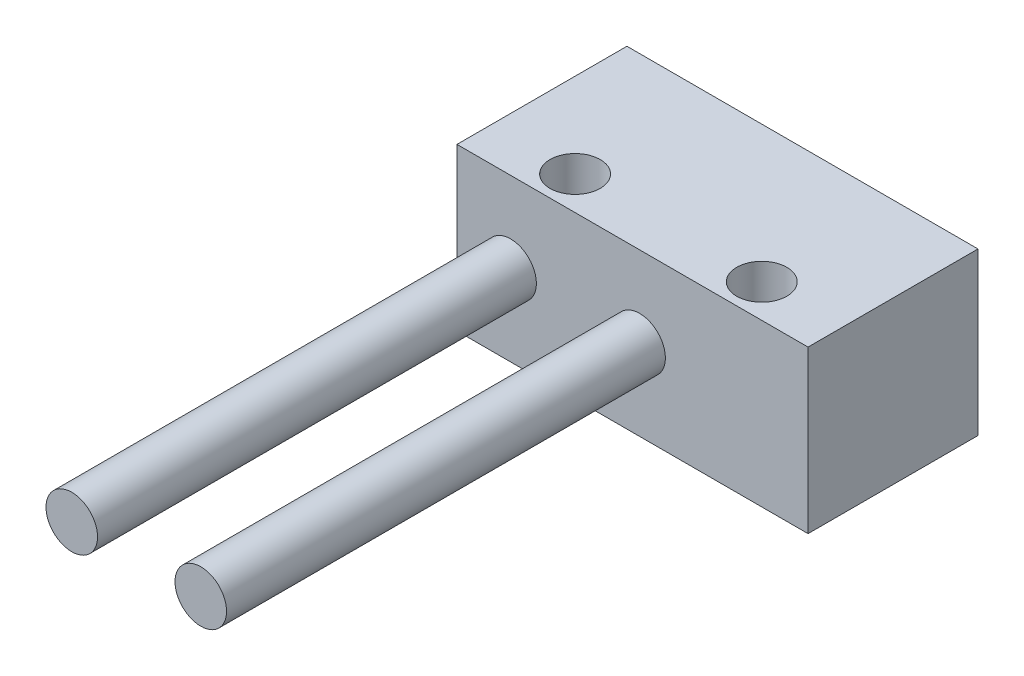
ISO-10303-21;
HEADER;
FILE_DESCRIPTION(('STEP AP214'),'2;1');
FILE_NAME('part.step','',(''),(''),'','','');
FILE_SCHEMA(('AUTOMOTIVE_DESIGN { 1 0 10303 214 1 1 1 1 }'));
ENDSEC;
DATA;
#1=APPLICATION_CONTEXT('core data for automotive mechanical design processes');
#2=APPLICATION_PROTOCOL_DEFINITION('international standard','automotive_design',2000,#1);
#3=PRODUCT_CONTEXT('',#1,'mechanical');
#4=PRODUCT('Part','Part','',(#3));
#5=PRODUCT_RELATED_PRODUCT_CATEGORY('part','',(#4));
#6=PRODUCT_DEFINITION_FORMATION('','',#4);
#7=PRODUCT_DEFINITION_CONTEXT('part definition',#1,'design');
#8=PRODUCT_DEFINITION('design','',#6,#7);
#9=PRODUCT_DEFINITION_SHAPE('','',#8);
#10=(LENGTH_UNIT() NAMED_UNIT(*) SI_UNIT(.MILLI.,.METRE.));
#11=(NAMED_UNIT(*) PLANE_ANGLE_UNIT() SI_UNIT($,.RADIAN.));
#12=(NAMED_UNIT(*) SI_UNIT($,.STERADIAN.) SOLID_ANGLE_UNIT());
#13=UNCERTAINTY_MEASURE_WITH_UNIT(LENGTH_MEASURE(1.E-05),#10,'distance_accuracy_value','');
#14=(GEOMETRIC_REPRESENTATION_CONTEXT(3) GLOBAL_UNCERTAINTY_ASSIGNED_CONTEXT((#13)) GLOBAL_UNIT_ASSIGNED_CONTEXT((#10,
#11,#12)) REPRESENTATION_CONTEXT('',''));
#15=CARTESIAN_POINT('',(0.,0.,0.));
#16=DIRECTION('',(0.,0.,1.));
#17=DIRECTION('',(1.,0.,0.));
#18=AXIS2_PLACEMENT_3D('',#15,#16,#17);
#19=CARTESIAN_POINT('',(0.,5.8,-6.1));
#20=DIRECTION('',(0.,0.,1.));
#21=DIRECTION('',(1.,0.,0.));
#22=AXIS2_PLACEMENT_3D('',#19,#20,#21);
#23=PLANE('',#22);
#24=DIRECTION('',(-1.,0.,0.));
#25=VECTOR('',#24,1.);
#26=CARTESIAN_POINT('',(0.,0.,-6.1));
#27=LINE('',#26,#25);
#28=CARTESIAN_POINT('',(12.6,0.,-6.1));
#29=VERTEX_POINT('',#28);
#30=CARTESIAN_POINT('',(0.,0.,-6.1));
#31=VERTEX_POINT('',#30);
#32=EDGE_CURVE('E154',#29,#31,#27,.T.);
#33=ORIENTED_EDGE('',*,*,#32,.T.);
#34=DIRECTION('',(0.,-1.,0.));
#35=VECTOR('',#34,1.);
#36=CARTESIAN_POINT('',(0.,5.8,-6.1));
#37=LINE('',#36,#35);
#38=CARTESIAN_POINT('',(0.,5.8,-6.1));
#39=VERTEX_POINT('',#38);
#40=EDGE_CURVE('E160',#39,#31,#37,.T.);
#41=ORIENTED_EDGE('',*,*,#40,.F.);
#42=DIRECTION('',(-1.,0.,0.));
#43=VECTOR('',#42,1.);
#44=CARTESIAN_POINT('',(0.,5.8,-6.1));
#45=LINE('',#44,#43);
#46=CARTESIAN_POINT('',(12.6,5.8,-6.1));
#47=VERTEX_POINT('',#46);
#48=EDGE_CURVE('E158',#47,#39,#45,.T.);
#49=ORIENTED_EDGE('',*,*,#48,.F.);
#50=DIRECTION('',(0.,-1.,0.));
#51=VECTOR('',#50,1.);
#52=CARTESIAN_POINT('',(12.6,5.8,-6.1));
#53=LINE('',#52,#51);
#54=EDGE_CURVE('E170',#47,#29,#53,.T.);
#55=ORIENTED_EDGE('',*,*,#54,.T.);
#56=EDGE_LOOP('',(#33,#41,#49,#55));
#57=FACE_BOUND('',#56,.T.);
#58=DIRECTION('',(0.,-1.,0.));
#59=VECTOR('',#58,1.);
#60=CARTESIAN_POINT('',(5.,1.525,-6.1));
#61=LINE('',#60,#59);
#62=CARTESIAN_POINT('',(5.,4.275,-6.1));
#63=VERTEX_POINT('',#62);
#64=CARTESIAN_POINT('',(5.,1.525,-6.1));
#65=VERTEX_POINT('',#64);
#66=EDGE_CURVE('E131',#63,#65,#61,.T.);
#67=ORIENTED_EDGE('',*,*,#66,.F.);
#68=DIRECTION('',(1.,0.,0.));
#69=VECTOR('',#68,1.);
#70=CARTESIAN_POINT('',(5.,4.275,-6.1));
#71=LINE('',#70,#69);
#72=CARTESIAN_POINT('',(4.,4.275,-6.1));
#73=VERTEX_POINT('',#72);
#74=EDGE_CURVE('E128',#73,#63,#71,.T.);
#75=ORIENTED_EDGE('',*,*,#74,.F.);
#76=DIRECTION('',(0.,1.,0.));
#77=VECTOR('',#76,1.);
#78=CARTESIAN_POINT('',(4.,1.525,-6.1));
#79=LINE('',#78,#77);
#80=CARTESIAN_POINT('',(4.,1.525,-6.1));
#81=VERTEX_POINT('',#80);
#82=EDGE_CURVE('E66',#81,#73,#79,.T.);
#83=ORIENTED_EDGE('',*,*,#82,.F.);
#84=DIRECTION('',(-1.,0.,0.));
#85=VECTOR('',#84,1.);
#86=CARTESIAN_POINT('',(5.,1.525,-6.1));
#87=LINE('',#86,#85);
#88=EDGE_CURVE('E61',#65,#81,#87,.T.);
#89=ORIENTED_EDGE('',*,*,#88,.F.);
#90=EDGE_LOOP('',(#67,#75,#83,#89));
#91=FACE_BOUND('',#90,.T.);
#92=ADVANCED_FACE('F46',(#57,#91),#23,.F.);
#93=CARTESIAN_POINT('',(0.,5.8,0.));
#94=DIRECTION('',(0.,-1.,0.));
#95=DIRECTION('',(0.,0.,-1.));
#96=AXIS2_PLACEMENT_3D('',#93,#94,#95);
#97=PLANE('',#96);
#98=DIRECTION('',(0.,0.,1.));
#99=VECTOR('',#98,1.);
#100=CARTESIAN_POINT('',(0.,5.8,0.));
#101=LINE('',#100,#99);
#102=CARTESIAN_POINT('',(0.,5.8,0.));
#103=VERTEX_POINT('',#102);
#104=EDGE_CURVE('E150',#39,#103,#101,.T.);
#105=ORIENTED_EDGE('',*,*,#104,.T.);
#106=DIRECTION('',(1.,0.,0.));
#107=VECTOR('',#106,1.);
#108=CARTESIAN_POINT('',(0.,5.8,0.));
#109=LINE('',#108,#107);
#110=CARTESIAN_POINT('',(12.6,5.8,0.));
#111=VERTEX_POINT('',#110);
#112=EDGE_CURVE('E153',#103,#111,#109,.T.);
#113=ORIENTED_EDGE('',*,*,#112,.T.);
#114=DIRECTION('',(0.,0.,-1.));
#115=VECTOR('',#114,1.);
#116=CARTESIAN_POINT('',(12.6,5.8,0.));
#117=LINE('',#116,#115);
#118=EDGE_CURVE('E156',#111,#47,#117,.T.);
#119=ORIENTED_EDGE('',*,*,#118,.T.);
#120=ORIENTED_EDGE('',*,*,#48,.T.);
#121=EDGE_LOOP('',(#105,#113,#119,#120));
#122=FACE_BOUND('',#121,.T.);
#123=CARTESIAN_POINT('',(3.04,5.8,-1.2));
#124=DIRECTION('',(0.,1.,0.));
#125=DIRECTION('',(0.,0.,1.));
#126=AXIS2_PLACEMENT_3D('',#123,#124,#125);
#127=CIRCLE('',#126,0.9);
#128=CARTESIAN_POINT('',(3.04,5.8,-0.3));
#129=VERTEX_POINT('',#128);
#130=EDGE_CURVE('E144',#129,#129,#127,.T.);
#131=ORIENTED_EDGE('',*,*,#130,.F.);
#132=EDGE_LOOP('',(#131));
#133=FACE_BOUND('',#132,.T.);
#134=CARTESIAN_POINT('',(9.74,5.8,-1.2));
#135=DIRECTION('',(0.,1.,0.));
#136=DIRECTION('',(0.,0.,1.));
#137=AXIS2_PLACEMENT_3D('',#134,#135,#136);
#138=CIRCLE('',#137,0.9);
#139=CARTESIAN_POINT('',(9.74,5.8,-0.299999999999999));
#140=VERTEX_POINT('',#139);
#141=EDGE_CURVE('E135',#140,#140,#138,.T.);
#142=ORIENTED_EDGE('',*,*,#141,.F.);
#143=EDGE_LOOP('',(#142));
#144=FACE_BOUND('',#143,.T.);
#145=ADVANCED_FACE('F205',(#122,#133,#144),#97,.F.);
#146=CARTESIAN_POINT('',(0.,0.,0.));
#147=DIRECTION('',(0.,-1.,0.));
#148=DIRECTION('',(0.,0.,-1.));
#149=AXIS2_PLACEMENT_3D('',#146,#147,#148);
#150=PLANE('',#149);
#151=CARTESIAN_POINT('',(3.04,0.,-1.2));
#152=DIRECTION('',(0.,1.,0.));
#153=DIRECTION('',(0.,0.,1.));
#154=AXIS2_PLACEMENT_3D('',#151,#152,#153);
#155=CIRCLE('',#154,0.9);
#156=CARTESIAN_POINT('',(3.04,0.,-0.3));
#157=VERTEX_POINT('',#156);
#158=EDGE_CURVE('E142',#157,#157,#155,.T.);
#159=ORIENTED_EDGE('',*,*,#158,.T.);
#160=EDGE_LOOP('',(#159));
#161=FACE_BOUND('',#160,.T.);
#162=DIRECTION('',(0.,0.,1.));
#163=VECTOR('',#162,1.);
#164=CARTESIAN_POINT('',(0.,0.,0.));
#165=LINE('',#164,#163);
#166=CARTESIAN_POINT('',(0.,0.,0.));
#167=VERTEX_POINT('',#166);
#168=EDGE_CURVE('E147',#31,#167,#165,.T.);
#169=ORIENTED_EDGE('',*,*,#168,.F.);
#170=ORIENTED_EDGE('',*,*,#32,.F.);
#171=DIRECTION('',(0.,0.,-1.));
#172=VECTOR('',#171,1.);
#173=CARTESIAN_POINT('',(12.6,0.,0.));
#174=LINE('',#173,#172);
#175=CARTESIAN_POINT('',(12.6,0.,0.));
#176=VERTEX_POINT('',#175);
#177=EDGE_CURVE('E165',#176,#29,#174,.T.);
#178=ORIENTED_EDGE('',*,*,#177,.F.);
#179=DIRECTION('',(1.,0.,0.));
#180=VECTOR('',#179,1.);
#181=CARTESIAN_POINT('',(0.,0.,0.));
#182=LINE('',#181,#180);
#183=EDGE_CURVE('E163',#167,#176,#182,.T.);
#184=ORIENTED_EDGE('',*,*,#183,.F.);
#185=EDGE_LOOP('',(#169,#170,#178,#184));
#186=FACE_BOUND('',#185,.T.);
#187=CARTESIAN_POINT('',(9.74,0.,-1.2));
#188=DIRECTION('',(0.,1.,0.));
#189=DIRECTION('',(0.,0.,1.));
#190=AXIS2_PLACEMENT_3D('',#187,#188,#189);
#191=CIRCLE('',#190,0.9);
#192=CARTESIAN_POINT('',(9.74,0.,-0.299999999999999));
#193=VERTEX_POINT('',#192);
#194=EDGE_CURVE('E132',#193,#193,#191,.T.);
#195=ORIENTED_EDGE('',*,*,#194,.T.);
#196=EDGE_LOOP('',(#195));
#197=FACE_BOUND('',#196,.T.);
#198=ADVANCED_FACE('F197',(#161,#186,#197),#150,.T.);
#199=CARTESIAN_POINT('',(0.,5.8,0.));
#200=DIRECTION('',(1.,0.,0.));
#201=DIRECTION('',(0.,0.,-1.));
#202=AXIS2_PLACEMENT_3D('',#199,#200,#201);
#203=PLANE('',#202);
#204=ORIENTED_EDGE('',*,*,#168,.T.);
#205=DIRECTION('',(0.,-1.,0.));
#206=VECTOR('',#205,1.);
#207=CARTESIAN_POINT('',(0.,5.8,0.));
#208=LINE('',#207,#206);
#209=EDGE_CURVE('E176',#103,#167,#208,.T.);
#210=ORIENTED_EDGE('',*,*,#209,.F.);
#211=ORIENTED_EDGE('',*,*,#104,.F.);
#212=ORIENTED_EDGE('',*,*,#40,.T.);
#213=EDGE_LOOP('',(#204,#210,#211,#212));
#214=FACE_BOUND('',#213,.T.);
#215=ADVANCED_FACE('F48',(#214),#203,.F.);
#216=CARTESIAN_POINT('',(0.,5.8,0.));
#217=DIRECTION('',(0.,0.,-1.));
#218=DIRECTION('',(-1.,0.,0.));
#219=AXIS2_PLACEMENT_3D('',#216,#217,#218);
#220=PLANE('',#219);
#221=CARTESIAN_POINT('',(6.555,2.9,0.));
#222=DIRECTION('',(0.,0.,-1.));
#223=DIRECTION('',(-1.,0.,0.));
#224=AXIS2_PLACEMENT_3D('',#221,#222,#223);
#225=CIRCLE('',#224,0.925000000000002);
#226=CARTESIAN_POINT('',(5.63,2.9,0.));
#227=VERTEX_POINT('',#226);
#228=EDGE_CURVE('E13',#227,#227,#225,.F.);
#229=ORIENTED_EDGE('',*,*,#228,.F.);
#230=EDGE_LOOP('',(#229));
#231=FACE_BOUND('',#230,.T.);
#232=CARTESIAN_POINT('',(1.925,2.9,0.));
#233=DIRECTION('',(0.,0.,-1.));
#234=DIRECTION('',(-1.,0.,0.));
#235=AXIS2_PLACEMENT_3D('',#232,#233,#234);
#236=CIRCLE('',#235,0.925);
#237=CARTESIAN_POINT('',(1.,2.9,0.));
#238=VERTEX_POINT('',#237);
#239=EDGE_CURVE('E54',#238,#238,#236,.F.);
#240=ORIENTED_EDGE('',*,*,#239,.F.);
#241=EDGE_LOOP('',(#240));
#242=FACE_BOUND('',#241,.T.);
#243=ORIENTED_EDGE('',*,*,#183,.T.);
#244=DIRECTION('',(0.,-1.,0.));
#245=VECTOR('',#244,1.);
#246=CARTESIAN_POINT('',(12.6,5.8,0.));
#247=LINE('',#246,#245);
#248=EDGE_CURVE('E173',#111,#176,#247,.T.);
#249=ORIENTED_EDGE('',*,*,#248,.F.);
#250=ORIENTED_EDGE('',*,*,#112,.F.);
#251=ORIENTED_EDGE('',*,*,#209,.T.);
#252=EDGE_LOOP('',(#243,#249,#250,#251));
#253=FACE_BOUND('',#252,.T.);
#254=ADVANCED_FACE('F183',(#231,#242,#253),#220,.F.);
#255=CARTESIAN_POINT('',(12.6,5.8,0.));
#256=DIRECTION('',(-1.,0.,0.));
#257=DIRECTION('',(0.,0.,1.));
#258=AXIS2_PLACEMENT_3D('',#255,#256,#257);
#259=PLANE('',#258);
#260=ORIENTED_EDGE('',*,*,#177,.T.);
#261=ORIENTED_EDGE('',*,*,#54,.F.);
#262=ORIENTED_EDGE('',*,*,#118,.F.);
#263=ORIENTED_EDGE('',*,*,#248,.T.);
#264=EDGE_LOOP('',(#260,#261,#262,#263));
#265=FACE_BOUND('',#264,.T.);
#266=ADVANCED_FACE('F186',(#265),#259,.F.);
#267=CARTESIAN_POINT('',(3.04,5.8,-1.2));
#268=DIRECTION('',(0.,-1.,0.));
#269=DIRECTION('',(0.,0.,-1.));
#270=AXIS2_PLACEMENT_3D('',#267,#268,#269);
#271=CYLINDRICAL_SURFACE('',#270,0.9);
#272=ORIENTED_EDGE('',*,*,#130,.T.);
#273=EDGE_LOOP('',(#272));
#274=FACE_BOUND('',#273,.T.);
#275=ORIENTED_EDGE('',*,*,#158,.F.);
#276=EDGE_LOOP('',(#275));
#277=FACE_BOUND('',#276,.T.);
#278=ADVANCED_FACE('F216',(#274,#277),#271,.F.);
#279=CARTESIAN_POINT('',(9.74,5.8,-1.2));
#280=DIRECTION('',(0.,-1.,0.));
#281=DIRECTION('',(0.,0.,-1.));
#282=AXIS2_PLACEMENT_3D('',#279,#280,#281);
#283=CYLINDRICAL_SURFACE('',#282,0.9);
#284=ORIENTED_EDGE('',*,*,#141,.T.);
#285=EDGE_LOOP('',(#284));
#286=FACE_BOUND('',#285,.T.);
#287=ORIENTED_EDGE('',*,*,#194,.F.);
#288=EDGE_LOOP('',(#287));
#289=FACE_BOUND('',#288,.T.);
#290=ADVANCED_FACE('F213',(#286,#289),#283,.F.);
#291=CARTESIAN_POINT('',(5.,1.525,-7.1));
#292=DIRECTION('',(-1.,0.,0.));
#293=DIRECTION('',(0.,0.,1.));
#294=AXIS2_PLACEMENT_3D('',#291,#292,#293);
#295=PLANE('',#294);
#296=ORIENTED_EDGE('',*,*,#66,.T.);
#297=DIRECTION('',(0.,0.,1.));
#298=VECTOR('',#297,1.);
#299=CARTESIAN_POINT('',(5.,1.525,-7.1));
#300=LINE('',#299,#298);
#301=CARTESIAN_POINT('',(5.,1.525,-7.1));
#302=VERTEX_POINT('',#301);
#303=EDGE_CURVE('E112',#302,#65,#300,.T.);
#304=ORIENTED_EDGE('',*,*,#303,.F.);
#305=DIRECTION('',(0.,-1.,0.));
#306=VECTOR('',#305,1.);
#307=CARTESIAN_POINT('',(5.,1.525,-7.1));
#308=LINE('',#307,#306);
#309=CARTESIAN_POINT('',(5.,4.275,-7.1));
#310=VERTEX_POINT('',#309);
#311=EDGE_CURVE('E119',#310,#302,#308,.T.);
#312=ORIENTED_EDGE('',*,*,#311,.F.);
#313=DIRECTION('',(0.,0.,1.));
#314=VECTOR('',#313,1.);
#315=CARTESIAN_POINT('',(5.,4.275,-7.1));
#316=LINE('',#315,#314);
#317=EDGE_CURVE('E280',#310,#63,#316,.T.);
#318=ORIENTED_EDGE('',*,*,#317,.T.);
#319=EDGE_LOOP('',(#296,#304,#312,#318));
#320=FACE_BOUND('',#319,.T.);
#321=ADVANCED_FACE('F130',(#320),#295,.F.);
#322=CARTESIAN_POINT('',(5.,1.525,-7.1));
#323=DIRECTION('',(0.,1.,0.));
#324=DIRECTION('',(0.,0.,1.));
#325=AXIS2_PLACEMENT_3D('',#322,#323,#324);
#326=PLANE('',#325);
#327=ORIENTED_EDGE('',*,*,#88,.T.);
#328=DIRECTION('',(0.,0.,1.));
#329=VECTOR('',#328,1.);
#330=CARTESIAN_POINT('',(4.,1.525,-7.1));
#331=LINE('',#330,#329);
#332=CARTESIAN_POINT('',(4.,1.525,-7.1));
#333=VERTEX_POINT('',#332);
#334=EDGE_CURVE('E115',#333,#81,#331,.T.);
#335=ORIENTED_EDGE('',*,*,#334,.F.);
#336=DIRECTION('',(-1.,0.,0.));
#337=VECTOR('',#336,1.);
#338=CARTESIAN_POINT('',(5.,1.525,-7.1));
#339=LINE('',#338,#337);
#340=EDGE_CURVE('E108',#302,#333,#339,.T.);
#341=ORIENTED_EDGE('',*,*,#340,.F.);
#342=ORIENTED_EDGE('',*,*,#303,.T.);
#343=EDGE_LOOP('',(#327,#335,#341,#342));
#344=FACE_BOUND('',#343,.T.);
#345=ADVANCED_FACE('F110',(#344),#326,.F.);
#346=CARTESIAN_POINT('',(4.,1.525,-7.1));
#347=DIRECTION('',(1.,0.,0.));
#348=DIRECTION('',(0.,0.,-1.));
#349=AXIS2_PLACEMENT_3D('',#346,#347,#348);
#350=PLANE('',#349);
#351=ORIENTED_EDGE('',*,*,#82,.T.);
#352=DIRECTION('',(0.,0.,1.));
#353=VECTOR('',#352,1.);
#354=CARTESIAN_POINT('',(4.,4.275,-7.1));
#355=LINE('',#354,#353);
#356=CARTESIAN_POINT('',(4.,4.275,-7.1));
#357=VERTEX_POINT('',#356);
#358=EDGE_CURVE('E137',#357,#73,#355,.T.);
#359=ORIENTED_EDGE('',*,*,#358,.F.);
#360=DIRECTION('',(0.,1.,0.));
#361=VECTOR('',#360,1.);
#362=CARTESIAN_POINT('',(4.,1.525,-7.1));
#363=LINE('',#362,#361);
#364=EDGE_CURVE('E118',#333,#357,#363,.T.);
#365=ORIENTED_EDGE('',*,*,#364,.F.);
#366=ORIENTED_EDGE('',*,*,#334,.T.);
#367=EDGE_LOOP('',(#351,#359,#365,#366));
#368=FACE_BOUND('',#367,.T.);
#369=ADVANCED_FACE('F244',(#368),#350,.F.);
#370=CARTESIAN_POINT('',(5.,4.275,-7.1));
#371=DIRECTION('',(0.,-1.,0.));
#372=DIRECTION('',(0.,0.,-1.));
#373=AXIS2_PLACEMENT_3D('',#370,#371,#372);
#374=PLANE('',#373);
#375=ORIENTED_EDGE('',*,*,#74,.T.);
#376=ORIENTED_EDGE('',*,*,#317,.F.);
#377=DIRECTION('',(1.,0.,0.));
#378=VECTOR('',#377,1.);
#379=CARTESIAN_POINT('',(5.,4.275,-7.1));
#380=LINE('',#379,#378);
#381=EDGE_CURVE('E124',#357,#310,#380,.T.);
#382=ORIENTED_EDGE('',*,*,#381,.F.);
#383=ORIENTED_EDGE('',*,*,#358,.T.);
#384=EDGE_LOOP('',(#375,#376,#382,#383));
#385=FACE_BOUND('',#384,.T.);
#386=ADVANCED_FACE('F247',(#385),#374,.F.);
#387=CARTESIAN_POINT('',(0.,0.,-7.1));
#388=DIRECTION('',(0.,0.,1.));
#389=DIRECTION('',(1.,0.,0.));
#390=AXIS2_PLACEMENT_3D('',#387,#388,#389);
#391=PLANE('',#390);
#392=ORIENTED_EDGE('',*,*,#311,.T.);
#393=ORIENTED_EDGE('',*,*,#340,.T.);
#394=ORIENTED_EDGE('',*,*,#364,.T.);
#395=ORIENTED_EDGE('',*,*,#381,.T.);
#396=EDGE_LOOP('',(#392,#393,#394,#395));
#397=FACE_BOUND('',#396,.T.);
#398=ADVANCED_FACE('F122',(#397),#391,.F.);
#399=CARTESIAN_POINT('',(1.925,2.9,15.75));
#400=DIRECTION('',(0.,0.,-1.));
#401=DIRECTION('',(-1.,0.,0.));
#402=AXIS2_PLACEMENT_3D('',#399,#400,#401);
#403=CYLINDRICAL_SURFACE('',#402,0.925);
#404=CARTESIAN_POINT('',(1.925,2.9,15.75));
#405=DIRECTION('',(0.,0.,1.));
#406=DIRECTION('',(1.,0.,0.));
#407=AXIS2_PLACEMENT_3D('',#404,#405,#406);
#408=CIRCLE('',#407,0.925);
#409=CARTESIAN_POINT('',(2.85,2.9,15.75));
#410=VERTEX_POINT('',#409);
#411=EDGE_CURVE('E273',#410,#410,#408,.T.);
#412=ORIENTED_EDGE('',*,*,#411,.F.);
#413=EDGE_LOOP('',(#412));
#414=FACE_BOUND('',#413,.T.);
#415=ORIENTED_EDGE('',*,*,#239,.T.);
#416=EDGE_LOOP('',(#415));
#417=FACE_BOUND('',#416,.T.);
#418=ADVANCED_FACE('F181',(#414,#417),#403,.T.);
#419=CARTESIAN_POINT('',(1.925,2.9,15.75));
#420=DIRECTION('',(0.,0.,1.));
#421=DIRECTION('',(1.,0.,0.));
#422=AXIS2_PLACEMENT_3D('',#419,#420,#421);
#423=PLANE('',#422);
#424=ORIENTED_EDGE('',*,*,#411,.T.);
#425=EDGE_LOOP('',(#424));
#426=FACE_BOUND('',#425,.T.);
#427=ADVANCED_FACE('F256',(#426),#423,.T.);
#428=CARTESIAN_POINT('',(6.555,2.9,15.75));
#429=DIRECTION('',(0.,0.,-1.));
#430=DIRECTION('',(-1.,0.,0.));
#431=AXIS2_PLACEMENT_3D('',#428,#429,#430);
#432=CYLINDRICAL_SURFACE('',#431,0.925000000000002);
#433=CARTESIAN_POINT('',(6.555,2.9,15.75));
#434=DIRECTION('',(0.,0.,1.));
#435=DIRECTION('',(1.,0.,0.));
#436=AXIS2_PLACEMENT_3D('',#433,#434,#435);
#437=CIRCLE('',#436,0.925000000000002);
#438=CARTESIAN_POINT('',(7.48,2.9,15.75));
#439=VERTEX_POINT('',#438);
#440=EDGE_CURVE('E272',#439,#439,#437,.T.);
#441=ORIENTED_EDGE('',*,*,#440,.F.);
#442=EDGE_LOOP('',(#441));
#443=FACE_BOUND('',#442,.T.);
#444=ORIENTED_EDGE('',*,*,#228,.T.);
#445=EDGE_LOOP('',(#444));
#446=FACE_BOUND('',#445,.T.);
#447=ADVANCED_FACE('F260',(#443,#446),#432,.T.);
#448=CARTESIAN_POINT('',(6.555,2.9,15.75));
#449=DIRECTION('',(0.,0.,1.));
#450=DIRECTION('',(1.,0.,0.));
#451=AXIS2_PLACEMENT_3D('',#448,#449,#450);
#452=PLANE('',#451);
#453=ORIENTED_EDGE('',*,*,#440,.T.);
#454=EDGE_LOOP('',(#453));
#455=FACE_BOUND('',#454,.T.);
#456=ADVANCED_FACE('F264',(#455),#452,.T.);
#457=CLOSED_SHELL('',(#92,#145,#198,#215,#254,#266,#278,#290,#321,#345,#369,#386,#398,#418,#427,
#447,#456));
#458=MANIFOLD_SOLID_BREP('B2',#457);
#459=ADVANCED_BREP_SHAPE_REPRESENTATION('',(#18,#458),#14);
#460=SHAPE_DEFINITION_REPRESENTATION(#9,#459);
ENDSEC;
END-ISO-10303-21;
